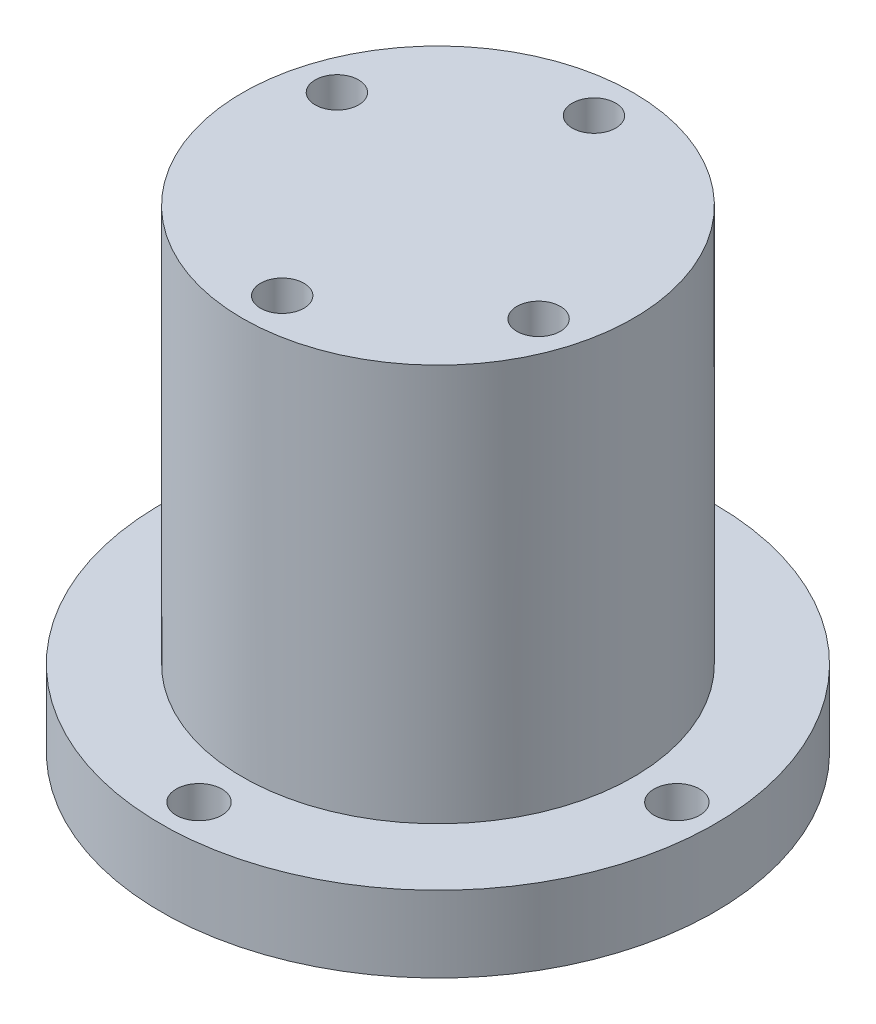
ISO-10303-21;
HEADER;
FILE_DESCRIPTION(('STEP AP214'),'2;1');
FILE_NAME('part.step','',(''),(''),'','','');
FILE_SCHEMA(('AUTOMOTIVE_DESIGN { 1 0 10303 214 1 1 1 1 }'));
ENDSEC;
DATA;
#1=APPLICATION_CONTEXT('core data for automotive mechanical design processes');
#2=APPLICATION_PROTOCOL_DEFINITION('international standard','automotive_design',2000,#1);
#3=PRODUCT_CONTEXT('',#1,'mechanical');
#4=PRODUCT('Part','Part','',(#3));
#5=PRODUCT_RELATED_PRODUCT_CATEGORY('part','',(#4));
#6=PRODUCT_DEFINITION_FORMATION('','',#4);
#7=PRODUCT_DEFINITION_CONTEXT('part definition',#1,'design');
#8=PRODUCT_DEFINITION('design','',#6,#7);
#9=PRODUCT_DEFINITION_SHAPE('','',#8);
#10=(LENGTH_UNIT() NAMED_UNIT(*) SI_UNIT(.MILLI.,.METRE.));
#11=(NAMED_UNIT(*) PLANE_ANGLE_UNIT() SI_UNIT($,.RADIAN.));
#12=(NAMED_UNIT(*) SI_UNIT($,.STERADIAN.) SOLID_ANGLE_UNIT());
#13=UNCERTAINTY_MEASURE_WITH_UNIT(LENGTH_MEASURE(1.E-05),#10,'distance_accuracy_value','');
#14=(GEOMETRIC_REPRESENTATION_CONTEXT(3) GLOBAL_UNCERTAINTY_ASSIGNED_CONTEXT((#13)) GLOBAL_UNIT_ASSIGNED_CONTEXT((#10,
#11,#12)) REPRESENTATION_CONTEXT('',''));
#15=CARTESIAN_POINT('',(0.,0.,0.));
#16=DIRECTION('',(0.,0.,1.));
#17=DIRECTION('',(1.,0.,0.));
#18=AXIS2_PLACEMENT_3D('',#15,#16,#17);
#19=CARTESIAN_POINT('',(0.,43.573,0.));
#20=DIRECTION('',(0.,-1.,0.));
#21=DIRECTION('',(0.,0.,-1.));
#22=AXIS2_PLACEMENT_3D('',#19,#20,#21);
#23=CYLINDRICAL_SURFACE('',#22,18.);
#24=CARTESIAN_POINT('',(0.,43.573,0.));
#25=DIRECTION('',(0.,1.,0.));
#26=DIRECTION('',(0.,0.,1.));
#27=AXIS2_PLACEMENT_3D('',#24,#25,#26);
#28=CIRCLE('',#27,18.);
#29=CARTESIAN_POINT('',(0.,43.573,18.));
#30=VERTEX_POINT('',#29);
#31=EDGE_CURVE('E51',#30,#30,#28,.T.);
#32=ORIENTED_EDGE('',*,*,#31,.F.);
#33=EDGE_LOOP('',(#32));
#34=FACE_BOUND('',#33,.T.);
#35=CARTESIAN_POINT('',(0.,7.,0.));
#36=DIRECTION('',(0.,-1.,0.));
#37=DIRECTION('',(0.,0.,-1.));
#38=AXIS2_PLACEMENT_3D('',#35,#36,#37);
#39=CIRCLE('',#38,18.);
#40=CARTESIAN_POINT('',(0.,7.,-18.));
#41=VERTEX_POINT('',#40);
#42=EDGE_CURVE('E10',#41,#41,#39,.T.);
#43=ORIENTED_EDGE('',*,*,#42,.F.);
#44=EDGE_LOOP('',(#43));
#45=FACE_BOUND('',#44,.T.);
#46=ADVANCED_FACE('F44',(#34,#45),#23,.T.);
#47=CARTESIAN_POINT('',(0.,43.573,0.));
#48=DIRECTION('',(0.,1.,0.));
#49=DIRECTION('',(0.,0.,1.));
#50=AXIS2_PLACEMENT_3D('',#47,#48,#49);
#51=PLANE('',#50);
#52=CARTESIAN_POINT('',(0.0083085857513019,43.573,-14.3598406926616));
#53=DIRECTION('',(0.,1.,0.));
#54=DIRECTION('',(0.,0.,1.));
#55=AXIS2_PLACEMENT_3D('',#52,#53,#54);
#56=CIRCLE('',#55,2.);
#57=CARTESIAN_POINT('',(0.0083085857513019,43.573,-12.3598406926616));
#58=VERTEX_POINT('',#57);
#59=EDGE_CURVE('E124',#58,#58,#56,.T.);
#60=ORIENTED_EDGE('',*,*,#59,.F.);
#61=EDGE_LOOP('',(#60));
#62=FACE_BOUND('',#61,.T.);
#63=CARTESIAN_POINT('',(13.6692470076208,43.573,4.39963407522347));
#64=DIRECTION('',(0.,1.,0.));
#65=DIRECTION('',(0.,0.,1.));
#66=AXIS2_PLACEMENT_3D('',#63,#64,#65);
#67=CIRCLE('',#66,2.);
#68=CARTESIAN_POINT('',(13.6692470076208,43.573,6.39963407522347));
#69=VERTEX_POINT('',#68);
#70=EDGE_CURVE('E120',#69,#69,#67,.T.);
#71=ORIENTED_EDGE('',*,*,#70,.F.);
#72=EDGE_LOOP('',(#71));
#73=FACE_BOUND('',#72,.T.);
#74=CARTESIAN_POINT('',(0.0189479353462987,43.573,14.3598305953435));
#75=DIRECTION('',(0.,1.,0.));
#76=DIRECTION('',(0.,0.,1.));
#77=AXIS2_PLACEMENT_3D('',#74,#75,#76);
#78=CIRCLE('',#77,2.00000000000001);
#79=CARTESIAN_POINT('',(0.0189479353462987,43.573,16.3598305953435));
#80=VERTEX_POINT('',#79);
#81=EDGE_CURVE('E112',#80,#80,#78,.T.);
#82=ORIENTED_EDGE('',*,*,#81,.F.);
#83=EDGE_LOOP('',(#82));
#84=FACE_BOUND('',#83,.T.);
#85=CARTESIAN_POINT('',(-13.6775733575443,43.573,-4.37368046388992));
#86=DIRECTION('',(0.,1.,0.));
#87=DIRECTION('',(0.,0.,1.));
#88=AXIS2_PLACEMENT_3D('',#85,#86,#87);
#89=CIRCLE('',#88,2.);
#90=CARTESIAN_POINT('',(-13.6775733575443,43.573,-2.37368046388993));
#91=VERTEX_POINT('',#90);
#92=EDGE_CURVE('E104',#91,#91,#89,.T.);
#93=ORIENTED_EDGE('',*,*,#92,.F.);
#94=EDGE_LOOP('',(#93));
#95=FACE_BOUND('',#94,.T.);
#96=ORIENTED_EDGE('',*,*,#31,.T.);
#97=EDGE_LOOP('',(#96));
#98=FACE_BOUND('',#97,.T.);
#99=ADVANCED_FACE('F141',(#62,#73,#84,#95,#98),#51,.T.);
#100=CARTESIAN_POINT('',(-22.,7.,0.));
#101=DIRECTION('',(0.,-1.,0.));
#102=DIRECTION('',(0.,0.,-1.));
#103=AXIS2_PLACEMENT_3D('',#100,#101,#102);
#104=CYLINDRICAL_SURFACE('',#103,2.1);
#105=CARTESIAN_POINT('',(-22.,7.,0.));
#106=DIRECTION('',(0.,-1.,0.));
#107=DIRECTION('',(0.,0.,-1.));
#108=AXIS2_PLACEMENT_3D('',#105,#106,#107);
#109=CIRCLE('',#108,2.1);
#110=CARTESIAN_POINT('',(-22.,7.,-2.1));
#111=VERTEX_POINT('',#110);
#112=EDGE_CURVE('E56',#111,#111,#109,.T.);
#113=ORIENTED_EDGE('',*,*,#112,.F.);
#114=EDGE_LOOP('',(#113));
#115=FACE_BOUND('',#114,.T.);
#116=CARTESIAN_POINT('',(-22.,0.,0.));
#117=DIRECTION('',(0.,-1.,0.));
#118=DIRECTION('',(0.,0.,-1.));
#119=AXIS2_PLACEMENT_3D('',#116,#117,#118);
#120=CIRCLE('',#119,2.1);
#121=CARTESIAN_POINT('',(-22.,0.,-2.1));
#122=VERTEX_POINT('',#121);
#123=EDGE_CURVE('E64',#122,#122,#120,.T.);
#124=ORIENTED_EDGE('',*,*,#123,.T.);
#125=EDGE_LOOP('',(#124));
#126=FACE_BOUND('',#125,.T.);
#127=ADVANCED_FACE('F144',(#115,#126),#104,.F.);
#128=CARTESIAN_POINT('',(0.,7.,0.));
#129=DIRECTION('',(0.,-1.,0.));
#130=DIRECTION('',(0.,0.,-1.));
#131=AXIS2_PLACEMENT_3D('',#128,#129,#130);
#132=CYLINDRICAL_SURFACE('',#131,25.5);
#133=CARTESIAN_POINT('',(0.,7.,0.));
#134=DIRECTION('',(0.,-1.,0.));
#135=DIRECTION('',(0.,0.,-1.));
#136=AXIS2_PLACEMENT_3D('',#133,#134,#135);
#137=CIRCLE('',#136,25.5);
#138=CARTESIAN_POINT('',(0.,7.,-25.5));
#139=VERTEX_POINT('',#138);
#140=EDGE_CURVE('E61',#139,#139,#137,.T.);
#141=ORIENTED_EDGE('',*,*,#140,.T.);
#142=EDGE_LOOP('',(#141));
#143=FACE_BOUND('',#142,.T.);
#144=CARTESIAN_POINT('',(0.,0.,0.));
#145=DIRECTION('',(0.,-1.,0.));
#146=DIRECTION('',(0.,0.,-1.));
#147=AXIS2_PLACEMENT_3D('',#144,#145,#146);
#148=CIRCLE('',#147,25.5);
#149=CARTESIAN_POINT('',(0.,0.,-25.5));
#150=VERTEX_POINT('',#149);
#151=EDGE_CURVE('E69',#150,#150,#148,.T.);
#152=ORIENTED_EDGE('',*,*,#151,.F.);
#153=EDGE_LOOP('',(#152));
#154=FACE_BOUND('',#153,.T.);
#155=ADVANCED_FACE('F185',(#143,#154),#132,.T.);
#156=CARTESIAN_POINT('',(0.,7.,-22.));
#157=DIRECTION('',(0.,-1.,0.));
#158=DIRECTION('',(0.,0.,-1.));
#159=AXIS2_PLACEMENT_3D('',#156,#157,#158);
#160=CYLINDRICAL_SURFACE('',#159,2.1);
#161=CARTESIAN_POINT('',(0.,7.,-22.));
#162=DIRECTION('',(0.,-1.,0.));
#163=DIRECTION('',(0.,0.,-1.));
#164=AXIS2_PLACEMENT_3D('',#161,#162,#163);
#165=CIRCLE('',#164,2.1);
#166=CARTESIAN_POINT('',(0.,7.,-24.1));
#167=VERTEX_POINT('',#166);
#168=EDGE_CURVE('E89',#167,#167,#165,.F.);
#169=ORIENTED_EDGE('',*,*,#168,.T.);
#170=EDGE_LOOP('',(#169));
#171=FACE_BOUND('',#170,.T.);
#172=CARTESIAN_POINT('',(0.,0.,-22.));
#173=DIRECTION('',(0.,-1.,0.));
#174=DIRECTION('',(0.,0.,-1.));
#175=AXIS2_PLACEMENT_3D('',#172,#173,#174);
#176=CIRCLE('',#175,2.1);
#177=CARTESIAN_POINT('',(0.,0.,-24.1));
#178=VERTEX_POINT('',#177);
#179=EDGE_CURVE('E73',#178,#178,#176,.F.);
#180=ORIENTED_EDGE('',*,*,#179,.F.);
#181=EDGE_LOOP('',(#180));
#182=FACE_BOUND('',#181,.T.);
#183=ADVANCED_FACE('F193',(#171,#182),#160,.F.);
#184=CARTESIAN_POINT('',(22.,7.,0.));
#185=DIRECTION('',(0.,-1.,0.));
#186=DIRECTION('',(0.,0.,-1.));
#187=AXIS2_PLACEMENT_3D('',#184,#185,#186);
#188=CYLINDRICAL_SURFACE('',#187,2.1);
#189=CARTESIAN_POINT('',(22.,7.,0.));
#190=DIRECTION('',(0.,-1.,0.));
#191=DIRECTION('',(0.,0.,-1.));
#192=AXIS2_PLACEMENT_3D('',#189,#190,#191);
#193=CIRCLE('',#192,2.1);
#194=CARTESIAN_POINT('',(22.,7.,-2.1));
#195=VERTEX_POINT('',#194);
#196=EDGE_CURVE('E93',#195,#195,#193,.F.);
#197=ORIENTED_EDGE('',*,*,#196,.T.);
#198=EDGE_LOOP('',(#197));
#199=FACE_BOUND('',#198,.T.);
#200=CARTESIAN_POINT('',(22.,0.,0.));
#201=DIRECTION('',(0.,-1.,0.));
#202=DIRECTION('',(0.,0.,-1.));
#203=AXIS2_PLACEMENT_3D('',#200,#201,#202);
#204=CIRCLE('',#203,2.1);
#205=CARTESIAN_POINT('',(22.,0.,-2.1));
#206=VERTEX_POINT('',#205);
#207=EDGE_CURVE('E77',#206,#206,#204,.F.);
#208=ORIENTED_EDGE('',*,*,#207,.F.);
#209=EDGE_LOOP('',(#208));
#210=FACE_BOUND('',#209,.T.);
#211=ADVANCED_FACE('F201',(#199,#210),#188,.F.);
#212=CARTESIAN_POINT('',(0.,7.,22.));
#213=DIRECTION('',(0.,-1.,0.));
#214=DIRECTION('',(0.,0.,-1.));
#215=AXIS2_PLACEMENT_3D('',#212,#213,#214);
#216=CYLINDRICAL_SURFACE('',#215,2.1);
#217=CARTESIAN_POINT('',(0.,7.,22.));
#218=DIRECTION('',(0.,-1.,0.));
#219=DIRECTION('',(0.,0.,-1.));
#220=AXIS2_PLACEMENT_3D('',#217,#218,#219);
#221=CIRCLE('',#220,2.1);
#222=CARTESIAN_POINT('',(0.,7.,19.9));
#223=VERTEX_POINT('',#222);
#224=EDGE_CURVE('E68',#223,#223,#221,.T.);
#225=ORIENTED_EDGE('',*,*,#224,.F.);
#226=EDGE_LOOP('',(#225));
#227=FACE_BOUND('',#226,.T.);
#228=CARTESIAN_POINT('',(0.,0.,22.));
#229=DIRECTION('',(0.,-1.,0.));
#230=DIRECTION('',(0.,0.,-1.));
#231=AXIS2_PLACEMENT_3D('',#228,#229,#230);
#232=CIRCLE('',#231,2.1);
#233=CARTESIAN_POINT('',(0.,0.,19.9));
#234=VERTEX_POINT('',#233);
#235=EDGE_CURVE('E81',#234,#234,#232,.T.);
#236=ORIENTED_EDGE('',*,*,#235,.T.);
#237=EDGE_LOOP('',(#236));
#238=FACE_BOUND('',#237,.T.);
#239=ADVANCED_FACE('F209',(#227,#238),#216,.F.);
#240=CARTESIAN_POINT('',(0.,7.,0.));
#241=DIRECTION('',(0.,-1.,0.));
#242=DIRECTION('',(0.,0.,-1.));
#243=AXIS2_PLACEMENT_3D('',#240,#241,#242);
#244=PLANE('',#243);
#245=ORIENTED_EDGE('',*,*,#224,.T.);
#246=EDGE_LOOP('',(#245));
#247=FACE_BOUND('',#246,.T.);
#248=ORIENTED_EDGE('',*,*,#196,.F.);
#249=EDGE_LOOP('',(#248));
#250=FACE_BOUND('',#249,.T.);
#251=ORIENTED_EDGE('',*,*,#168,.F.);
#252=EDGE_LOOP('',(#251));
#253=FACE_BOUND('',#252,.T.);
#254=ORIENTED_EDGE('',*,*,#140,.F.);
#255=EDGE_LOOP('',(#254));
#256=FACE_BOUND('',#255,.T.);
#257=ORIENTED_EDGE('',*,*,#112,.T.);
#258=EDGE_LOOP('',(#257));
#259=FACE_BOUND('',#258,.T.);
#260=ORIENTED_EDGE('',*,*,#42,.T.);
#261=EDGE_LOOP('',(#260));
#262=FACE_BOUND('',#261,.T.);
#263=ADVANCED_FACE('F165',(#247,#250,#253,#256,#259,#262),#244,.F.);
#264=CARTESIAN_POINT('',(0.,0.,0.));
#265=DIRECTION('',(0.,1.,0.));
#266=DIRECTION('',(0.,0.,1.));
#267=AXIS2_PLACEMENT_3D('',#264,#265,#266);
#268=PLANE('',#267);
#269=ORIENTED_EDGE('',*,*,#235,.F.);
#270=EDGE_LOOP('',(#269));
#271=FACE_BOUND('',#270,.T.);
#272=ORIENTED_EDGE('',*,*,#207,.T.);
#273=EDGE_LOOP('',(#272));
#274=FACE_BOUND('',#273,.T.);
#275=ORIENTED_EDGE('',*,*,#179,.T.);
#276=EDGE_LOOP('',(#275));
#277=FACE_BOUND('',#276,.T.);
#278=ORIENTED_EDGE('',*,*,#151,.T.);
#279=EDGE_LOOP('',(#278));
#280=FACE_BOUND('',#279,.T.);
#281=ORIENTED_EDGE('',*,*,#123,.F.);
#282=EDGE_LOOP('',(#281));
#283=FACE_BOUND('',#282,.T.);
#284=ADVANCED_FACE('F155',(#271,#274,#277,#280,#283),#268,.F.);
#285=CARTESIAN_POINT('',(-13.6775733575443,33.573,-4.37368046388992));
#286=DIRECTION('',(0.,1.,0.));
#287=DIRECTION('',(0.,0.,1.));
#288=AXIS2_PLACEMENT_3D('',#285,#286,#287);
#289=CYLINDRICAL_SURFACE('',#288,2.);
#290=CARTESIAN_POINT('',(-13.6775733575443,33.573,-4.37368046388992));
#291=DIRECTION('',(0.,1.,0.));
#292=DIRECTION('',(0.,0.,1.));
#293=AXIS2_PLACEMENT_3D('',#290,#291,#292);
#294=CIRCLE('',#293,2.);
#295=CARTESIAN_POINT('',(-13.6775733575443,33.573,-2.37368046388993));
#296=VERTEX_POINT('',#295);
#297=EDGE_CURVE('E100',#296,#296,#294,.T.);
#298=ORIENTED_EDGE('',*,*,#297,.F.);
#299=EDGE_LOOP('',(#298));
#300=FACE_BOUND('',#299,.T.);
#301=ORIENTED_EDGE('',*,*,#92,.T.);
#302=EDGE_LOOP('',(#301));
#303=FACE_BOUND('',#302,.T.);
#304=ADVANCED_FACE('F152',(#300,#303),#289,.F.);
#305=CARTESIAN_POINT('',(-13.6775733575443,33.573,-4.37368046388992));
#306=DIRECTION('',(0.,1.,0.));
#307=DIRECTION('',(0.,0.,1.));
#308=AXIS2_PLACEMENT_3D('',#305,#306,#307);
#309=PLANE('',#308);
#310=ORIENTED_EDGE('',*,*,#297,.T.);
#311=EDGE_LOOP('',(#310));
#312=FACE_BOUND('',#311,.T.);
#313=ADVANCED_FACE('F154',(#312),#309,.T.);
#314=CARTESIAN_POINT('',(0.0189479353462987,33.573,14.3598305953435));
#315=DIRECTION('',(0.,1.,0.));
#316=DIRECTION('',(0.,0.,1.));
#317=AXIS2_PLACEMENT_3D('',#314,#315,#316);
#318=CYLINDRICAL_SURFACE('',#317,2.00000000000001);
#319=CARTESIAN_POINT('',(0.0189479353462987,33.573,14.3598305953435));
#320=DIRECTION('',(0.,1.,0.));
#321=DIRECTION('',(0.,0.,1.));
#322=AXIS2_PLACEMENT_3D('',#319,#320,#321);
#323=CIRCLE('',#322,2.00000000000001);
#324=CARTESIAN_POINT('',(0.0189479353462987,33.573,16.3598305953435));
#325=VERTEX_POINT('',#324);
#326=EDGE_CURVE('E108',#325,#325,#323,.T.);
#327=ORIENTED_EDGE('',*,*,#326,.F.);
#328=EDGE_LOOP('',(#327));
#329=FACE_BOUND('',#328,.T.);
#330=ORIENTED_EDGE('',*,*,#81,.T.);
#331=EDGE_LOOP('',(#330));
#332=FACE_BOUND('',#331,.T.);
#333=ADVANCED_FACE('F162',(#329,#332),#318,.F.);
#334=CARTESIAN_POINT('',(0.0189479353462987,33.573,14.3598305953435));
#335=DIRECTION('',(0.,1.,0.));
#336=DIRECTION('',(0.,0.,1.));
#337=AXIS2_PLACEMENT_3D('',#334,#335,#336);
#338=PLANE('',#337);
#339=ORIENTED_EDGE('',*,*,#326,.T.);
#340=EDGE_LOOP('',(#339));
#341=FACE_BOUND('',#340,.T.);
#342=ADVANCED_FACE('F257',(#341),#338,.T.);
#343=CARTESIAN_POINT('',(13.6692470076208,33.573,4.39963407522347));
#344=DIRECTION('',(0.,1.,0.));
#345=DIRECTION('',(0.,0.,1.));
#346=AXIS2_PLACEMENT_3D('',#343,#344,#345);
#347=CYLINDRICAL_SURFACE('',#346,2.);
#348=CARTESIAN_POINT('',(13.6692470076208,33.573,4.39963407522347));
#349=DIRECTION('',(0.,1.,0.));
#350=DIRECTION('',(0.,0.,1.));
#351=AXIS2_PLACEMENT_3D('',#348,#349,#350);
#352=CIRCLE('',#351,2.);
#353=CARTESIAN_POINT('',(13.6692470076208,33.573,6.39963407522347));
#354=VERTEX_POINT('',#353);
#355=EDGE_CURVE('E116',#354,#354,#352,.T.);
#356=ORIENTED_EDGE('',*,*,#355,.F.);
#357=EDGE_LOOP('',(#356));
#358=FACE_BOUND('',#357,.T.);
#359=ORIENTED_EDGE('',*,*,#70,.T.);
#360=EDGE_LOOP('',(#359));
#361=FACE_BOUND('',#360,.T.);
#362=ADVANCED_FACE('F268',(#358,#361),#347,.F.);
#363=CARTESIAN_POINT('',(13.6692470076208,33.573,4.39963407522347));
#364=DIRECTION('',(0.,1.,0.));
#365=DIRECTION('',(0.,0.,1.));
#366=AXIS2_PLACEMENT_3D('',#363,#364,#365);
#367=PLANE('',#366);
#368=ORIENTED_EDGE('',*,*,#355,.T.);
#369=EDGE_LOOP('',(#368));
#370=FACE_BOUND('',#369,.T.);
#371=ADVANCED_FACE('F137',(#370),#367,.T.);
#372=CARTESIAN_POINT('',(0.0083085857513019,33.573,-14.3598406926616));
#373=DIRECTION('',(0.,1.,0.));
#374=DIRECTION('',(0.,0.,1.));
#375=AXIS2_PLACEMENT_3D('',#372,#373,#374);
#376=CYLINDRICAL_SURFACE('',#375,2.);
#377=CARTESIAN_POINT('',(0.0083085857513019,33.573,-14.3598406926616));
#378=DIRECTION('',(0.,1.,0.));
#379=DIRECTION('',(0.,0.,1.));
#380=AXIS2_PLACEMENT_3D('',#377,#378,#379);
#381=CIRCLE('',#380,2.);
#382=CARTESIAN_POINT('',(0.0083085857513019,33.573,-12.3598406926616));
#383=VERTEX_POINT('',#382);
#384=EDGE_CURVE('E84',#383,#383,#381,.T.);
#385=ORIENTED_EDGE('',*,*,#384,.F.);
#386=EDGE_LOOP('',(#385));
#387=FACE_BOUND('',#386,.T.);
#388=ORIENTED_EDGE('',*,*,#59,.T.);
#389=EDGE_LOOP('',(#388));
#390=FACE_BOUND('',#389,.T.);
#391=ADVANCED_FACE('F134',(#387,#390),#376,.F.);
#392=CARTESIAN_POINT('',(0.0083085857513019,33.573,-14.3598406926616));
#393=DIRECTION('',(0.,1.,0.));
#394=DIRECTION('',(0.,0.,1.));
#395=AXIS2_PLACEMENT_3D('',#392,#393,#394);
#396=PLANE('',#395);
#397=ORIENTED_EDGE('',*,*,#384,.T.);
#398=EDGE_LOOP('',(#397));
#399=FACE_BOUND('',#398,.T.);
#400=ADVANCED_FACE('F132',(#399),#396,.T.);
#401=CLOSED_SHELL('',(#46,#99,#127,#155,#183,#211,#239,#263,#284,#304,#313,#333,#342,#362,#371,
#391,#400));
#402=MANIFOLD_SOLID_BREP('B2',#401);
#403=ADVANCED_BREP_SHAPE_REPRESENTATION('',(#18,#402),#14);
#404=SHAPE_DEFINITION_REPRESENTATION(#9,#403);
ENDSEC;
END-ISO-10303-21;
